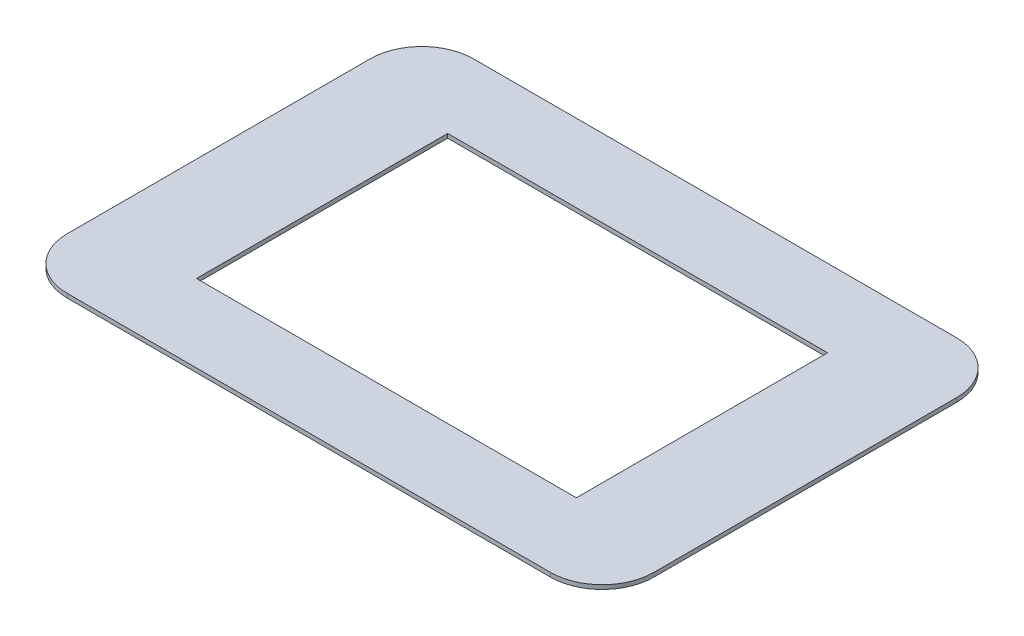
ISO-10303-21;
HEADER;
FILE_DESCRIPTION(('STEP AP214'),'2;1');
FILE_NAME('part.step','',(''),(''),'','','');
FILE_SCHEMA(('AUTOMOTIVE_DESIGN { 1 0 10303 214 1 1 1 1 }'));
ENDSEC;
DATA;
#1=APPLICATION_CONTEXT('core data for automotive mechanical design processes');
#2=APPLICATION_PROTOCOL_DEFINITION('international standard','automotive_design',2000,#1);
#3=PRODUCT_CONTEXT('',#1,'mechanical');
#4=PRODUCT('Part','Part','',(#3));
#5=PRODUCT_RELATED_PRODUCT_CATEGORY('part','',(#4));
#6=PRODUCT_DEFINITION_FORMATION('','',#4);
#7=PRODUCT_DEFINITION_CONTEXT('part definition',#1,'design');
#8=PRODUCT_DEFINITION('design','',#6,#7);
#9=PRODUCT_DEFINITION_SHAPE('','',#8);
#10=(LENGTH_UNIT() NAMED_UNIT(*) SI_UNIT(.MILLI.,.METRE.));
#11=(NAMED_UNIT(*) PLANE_ANGLE_UNIT() SI_UNIT($,.RADIAN.));
#12=(NAMED_UNIT(*) SI_UNIT($,.STERADIAN.) SOLID_ANGLE_UNIT());
#13=UNCERTAINTY_MEASURE_WITH_UNIT(LENGTH_MEASURE(1.E-05),#10,'distance_accuracy_value','');
#14=(GEOMETRIC_REPRESENTATION_CONTEXT(3) GLOBAL_UNCERTAINTY_ASSIGNED_CONTEXT((#13)) GLOBAL_UNIT_ASSIGNED_CONTEXT((#10,
#11,#12)) REPRESENTATION_CONTEXT('',''));
#15=CARTESIAN_POINT('',(0.,0.,0.));
#16=DIRECTION('',(0.,0.,1.));
#17=DIRECTION('',(1.,0.,0.));
#18=AXIS2_PLACEMENT_3D('',#15,#16,#17);
#19=CARTESIAN_POINT('',(103.5,0.8,-68.6));
#20=DIRECTION('',(0.,-1.,0.));
#21=DIRECTION('',(0.,0.,-1.));
#22=AXIS2_PLACEMENT_3D('',#19,#20,#21);
#23=PLANE('',#22);
#24=CARTESIAN_POINT('',(103.5,0.8,-68.6));
#25=DIRECTION('',(0.,1.,0.));
#26=DIRECTION('',(0.,0.,-1.));
#27=AXIS2_PLACEMENT_3D('',#24,#25,#26);
#28=CIRCLE('',#27,9.99999999999999);
#29=CARTESIAN_POINT('',(113.5,0.8,-68.6));
#30=VERTEX_POINT('',#29);
#31=CARTESIAN_POINT('',(103.5,0.8,-78.6));
#32=VERTEX_POINT('',#31);
#33=EDGE_CURVE('E158',#30,#32,#28,.T.);
#34=ORIENTED_EDGE('',*,*,#33,.T.);
#35=DIRECTION('',(-1.,0.,0.));
#36=VECTOR('',#35,1.);
#37=CARTESIAN_POINT('',(10.,0.8,-78.6));
#38=LINE('',#37,#36);
#39=CARTESIAN_POINT('',(10.,0.8,-78.6));
#40=VERTEX_POINT('',#39);
#41=EDGE_CURVE('E161',#32,#40,#38,.T.);
#42=ORIENTED_EDGE('',*,*,#41,.T.);
#43=CARTESIAN_POINT('',(10.,0.8,-68.6));
#44=DIRECTION('',(0.,1.,0.));
#45=DIRECTION('',(0.,0.,-1.));
#46=AXIS2_PLACEMENT_3D('',#43,#44,#45);
#47=CIRCLE('',#46,10.);
#48=CARTESIAN_POINT('',(0.,0.8,-68.6));
#49=VERTEX_POINT('',#48);
#50=EDGE_CURVE('E164',#40,#49,#47,.T.);
#51=ORIENTED_EDGE('',*,*,#50,.T.);
#52=DIRECTION('',(0.,0.,1.));
#53=VECTOR('',#52,1.);
#54=CARTESIAN_POINT('',(0.,0.8,-10.0000000000001));
#55=LINE('',#54,#53);
#56=CARTESIAN_POINT('',(0.,0.8,-10.0000000000001));
#57=VERTEX_POINT('',#56);
#58=EDGE_CURVE('E166',#49,#57,#55,.T.);
#59=ORIENTED_EDGE('',*,*,#58,.T.);
#60=CARTESIAN_POINT('',(10.,0.8,-10.));
#61=DIRECTION('',(0.,1.,0.));
#62=DIRECTION('',(0.,0.,-1.));
#63=AXIS2_PLACEMENT_3D('',#60,#61,#62);
#64=CIRCLE('',#63,10.);
#65=CARTESIAN_POINT('',(10.0000000000001,0.8,0.));
#66=VERTEX_POINT('',#65);
#67=EDGE_CURVE('E168',#57,#66,#64,.T.);
#68=ORIENTED_EDGE('',*,*,#67,.T.);
#69=DIRECTION('',(1.,0.,0.));
#70=VECTOR('',#69,1.);
#71=CARTESIAN_POINT('',(10.0000000000001,0.8,0.));
#72=LINE('',#71,#70);
#73=CARTESIAN_POINT('',(103.5,0.8,0.));
#74=VERTEX_POINT('',#73);
#75=EDGE_CURVE('E170',#66,#74,#72,.T.);
#76=ORIENTED_EDGE('',*,*,#75,.T.);
#77=CARTESIAN_POINT('',(103.5,0.8,-10.));
#78=DIRECTION('',(0.,1.,0.));
#79=DIRECTION('',(0.,0.,1.));
#80=AXIS2_PLACEMENT_3D('',#77,#78,#79);
#81=CIRCLE('',#80,10.);
#82=CARTESIAN_POINT('',(113.5,0.8,-10.));
#83=VERTEX_POINT('',#82);
#84=EDGE_CURVE('E172',#74,#83,#81,.T.);
#85=ORIENTED_EDGE('',*,*,#84,.T.);
#86=DIRECTION('',(0.,0.,-1.));
#87=VECTOR('',#86,1.);
#88=CARTESIAN_POINT('',(113.5,0.8,-10.));
#89=LINE('',#88,#87);
#90=EDGE_CURVE('E174',#83,#30,#89,.T.);
#91=ORIENTED_EDGE('',*,*,#90,.T.);
#92=EDGE_LOOP('',(#34,#42,#51,#59,#68,#76,#85,#91));
#93=FACE_BOUND('',#92,.T.);
#94=DIRECTION('',(0.,0.,1.));
#95=VECTOR('',#94,1.);
#96=CARTESIAN_POINT('',(20.,0.8,-15.));
#97=LINE('',#96,#95);
#98=CARTESIAN_POINT('',(20.,0.8,-63.6));
#99=VERTEX_POINT('',#98);
#100=CARTESIAN_POINT('',(20.,0.8,-15.));
#101=VERTEX_POINT('',#100);
#102=EDGE_CURVE('E122',#99,#101,#97,.T.);
#103=ORIENTED_EDGE('',*,*,#102,.F.);
#104=DIRECTION('',(-1.,0.,0.));
#105=VECTOR('',#104,1.);
#106=CARTESIAN_POINT('',(20.,0.8,-63.6));
#107=LINE('',#106,#105);
#108=CARTESIAN_POINT('',(93.5,0.8,-63.6));
#109=VERTEX_POINT('',#108);
#110=EDGE_CURVE('E144',#109,#99,#107,.T.);
#111=ORIENTED_EDGE('',*,*,#110,.F.);
#112=DIRECTION('',(0.,0.,-1.));
#113=VECTOR('',#112,1.);
#114=CARTESIAN_POINT('',(93.5,0.8,-15.));
#115=LINE('',#114,#113);
#116=CARTESIAN_POINT('',(93.5,0.8,-15.));
#117=VERTEX_POINT('',#116);
#118=EDGE_CURVE('E142',#117,#109,#115,.T.);
#119=ORIENTED_EDGE('',*,*,#118,.F.);
#120=DIRECTION('',(1.,0.,0.));
#121=VECTOR('',#120,1.);
#122=CARTESIAN_POINT('',(20.,0.8,-15.));
#123=LINE('',#122,#121);
#124=EDGE_CURVE('E130',#101,#117,#123,.T.);
#125=ORIENTED_EDGE('',*,*,#124,.F.);
#126=EDGE_LOOP('',(#103,#111,#119,#125));
#127=FACE_BOUND('',#126,.T.);
#128=ADVANCED_FACE('F33',(#93,#127),#23,.F.);
#129=CARTESIAN_POINT('',(103.5,0.,-68.6));
#130=DIRECTION('',(0.,-1.,0.));
#131=DIRECTION('',(0.,0.,-1.));
#132=AXIS2_PLACEMENT_3D('',#129,#130,#131);
#133=PLANE('',#132);
#134=CARTESIAN_POINT('',(103.5,0.,-68.6));
#135=DIRECTION('',(0.,1.,0.));
#136=DIRECTION('',(0.,0.,-1.));
#137=AXIS2_PLACEMENT_3D('',#134,#135,#136);
#138=CIRCLE('',#137,9.99999999999999);
#139=CARTESIAN_POINT('',(113.5,0.,-68.6));
#140=VERTEX_POINT('',#139);
#141=CARTESIAN_POINT('',(103.5,0.,-78.6));
#142=VERTEX_POINT('',#141);
#143=EDGE_CURVE('E138',#140,#142,#138,.T.);
#144=ORIENTED_EDGE('',*,*,#143,.F.);
#145=DIRECTION('',(0.,0.,-1.));
#146=VECTOR('',#145,1.);
#147=CARTESIAN_POINT('',(113.5,0.,-10.));
#148=LINE('',#147,#146);
#149=CARTESIAN_POINT('',(113.5,0.,-10.));
#150=VERTEX_POINT('',#149);
#151=EDGE_CURVE('E162',#150,#140,#148,.T.);
#152=ORIENTED_EDGE('',*,*,#151,.F.);
#153=CARTESIAN_POINT('',(103.5,0.,-10.));
#154=DIRECTION('',(0.,1.,0.));
#155=DIRECTION('',(0.,0.,1.));
#156=AXIS2_PLACEMENT_3D('',#153,#154,#155);
#157=CIRCLE('',#156,10.);
#158=CARTESIAN_POINT('',(103.5,0.,0.));
#159=VERTEX_POINT('',#158);
#160=EDGE_CURVE('E189',#159,#150,#157,.T.);
#161=ORIENTED_EDGE('',*,*,#160,.F.);
#162=DIRECTION('',(1.,0.,0.));
#163=VECTOR('',#162,1.);
#164=CARTESIAN_POINT('',(10.0000000000001,0.,0.));
#165=LINE('',#164,#163);
#166=CARTESIAN_POINT('',(10.0000000000001,0.,0.));
#167=VERTEX_POINT('',#166);
#168=EDGE_CURVE('E187',#167,#159,#165,.T.);
#169=ORIENTED_EDGE('',*,*,#168,.F.);
#170=CARTESIAN_POINT('',(10.,0.,-10.));
#171=DIRECTION('',(0.,1.,0.));
#172=DIRECTION('',(0.,0.,-1.));
#173=AXIS2_PLACEMENT_3D('',#170,#171,#172);
#174=CIRCLE('',#173,10.);
#175=CARTESIAN_POINT('',(0.,0.,-10.0000000000001));
#176=VERTEX_POINT('',#175);
#177=EDGE_CURVE('E185',#176,#167,#174,.T.);
#178=ORIENTED_EDGE('',*,*,#177,.F.);
#179=DIRECTION('',(0.,0.,1.));
#180=VECTOR('',#179,1.);
#181=CARTESIAN_POINT('',(0.,0.,-10.0000000000001));
#182=LINE('',#181,#180);
#183=CARTESIAN_POINT('',(0.,0.,-68.6));
#184=VERTEX_POINT('',#183);
#185=EDGE_CURVE('E183',#184,#176,#182,.T.);
#186=ORIENTED_EDGE('',*,*,#185,.F.);
#187=CARTESIAN_POINT('',(10.,0.,-68.6));
#188=DIRECTION('',(0.,1.,0.));
#189=DIRECTION('',(0.,0.,-1.));
#190=AXIS2_PLACEMENT_3D('',#187,#188,#189);
#191=CIRCLE('',#190,10.);
#192=CARTESIAN_POINT('',(10.,0.,-78.6));
#193=VERTEX_POINT('',#192);
#194=EDGE_CURVE('E181',#193,#184,#191,.T.);
#195=ORIENTED_EDGE('',*,*,#194,.F.);
#196=DIRECTION('',(-1.,0.,0.));
#197=VECTOR('',#196,1.);
#198=CARTESIAN_POINT('',(10.,0.,-78.6));
#199=LINE('',#198,#197);
#200=EDGE_CURVE('E179',#142,#193,#199,.T.);
#201=ORIENTED_EDGE('',*,*,#200,.F.);
#202=EDGE_LOOP('',(#144,#152,#161,#169,#178,#186,#195,#201));
#203=FACE_BOUND('',#202,.T.);
#204=DIRECTION('',(-1.,0.,0.));
#205=VECTOR('',#204,1.);
#206=CARTESIAN_POINT('',(20.,0.,-63.6));
#207=LINE('',#206,#205);
#208=CARTESIAN_POINT('',(93.5,0.,-63.6));
#209=VERTEX_POINT('',#208);
#210=CARTESIAN_POINT('',(20.,0.,-63.6));
#211=VERTEX_POINT('',#210);
#212=EDGE_CURVE('E131',#209,#211,#207,.T.);
#213=ORIENTED_EDGE('',*,*,#212,.T.);
#214=DIRECTION('',(0.,0.,1.));
#215=VECTOR('',#214,1.);
#216=CARTESIAN_POINT('',(20.,0.,-15.));
#217=LINE('',#216,#215);
#218=CARTESIAN_POINT('',(20.,0.,-15.));
#219=VERTEX_POINT('',#218);
#220=EDGE_CURVE('E56',#211,#219,#217,.T.);
#221=ORIENTED_EDGE('',*,*,#220,.T.);
#222=DIRECTION('',(1.,0.,0.));
#223=VECTOR('',#222,1.);
#224=CARTESIAN_POINT('',(20.,0.,-15.));
#225=LINE('',#224,#223);
#226=CARTESIAN_POINT('',(93.5,0.,-15.));
#227=VERTEX_POINT('',#226);
#228=EDGE_CURVE('E137',#219,#227,#225,.T.);
#229=ORIENTED_EDGE('',*,*,#228,.T.);
#230=DIRECTION('',(0.,0.,-1.));
#231=VECTOR('',#230,1.);
#232=CARTESIAN_POINT('',(93.5,0.,-15.));
#233=LINE('',#232,#231);
#234=EDGE_CURVE('E150',#227,#209,#233,.T.);
#235=ORIENTED_EDGE('',*,*,#234,.T.);
#236=EDGE_LOOP('',(#213,#221,#229,#235));
#237=FACE_BOUND('',#236,.T.);
#238=ADVANCED_FACE('F219',(#203,#237),#133,.T.);
#239=CARTESIAN_POINT('',(103.5,0.8,-68.6));
#240=DIRECTION('',(0.,-1.,0.));
#241=DIRECTION('',(0.,0.,-1.));
#242=AXIS2_PLACEMENT_3D('',#239,#240,#241);
#243=CYLINDRICAL_SURFACE('',#242,9.99999999999999);
#244=ORIENTED_EDGE('',*,*,#143,.T.);
#245=DIRECTION('',(0.,-1.,0.));
#246=VECTOR('',#245,1.);
#247=CARTESIAN_POINT('',(103.5,0.8,-78.6));
#248=LINE('',#247,#246);
#249=EDGE_CURVE('E11',#32,#142,#248,.T.);
#250=ORIENTED_EDGE('',*,*,#249,.F.);
#251=ORIENTED_EDGE('',*,*,#33,.F.);
#252=DIRECTION('',(0.,-1.,0.));
#253=VECTOR('',#252,1.);
#254=CARTESIAN_POINT('',(113.5,0.8,-68.6));
#255=LINE('',#254,#253);
#256=EDGE_CURVE('E176',#30,#140,#255,.T.);
#257=ORIENTED_EDGE('',*,*,#256,.T.);
#258=EDGE_LOOP('',(#244,#250,#251,#257));
#259=FACE_BOUND('',#258,.T.);
#260=ADVANCED_FACE('F35',(#259),#243,.T.);
#261=CARTESIAN_POINT('',(10.,0.8,-78.6));
#262=DIRECTION('',(0.,0.,1.));
#263=DIRECTION('',(1.,0.,0.));
#264=AXIS2_PLACEMENT_3D('',#261,#262,#263);
#265=PLANE('',#264);
#266=ORIENTED_EDGE('',*,*,#200,.T.);
#267=DIRECTION('',(0.,-1.,0.));
#268=VECTOR('',#267,1.);
#269=CARTESIAN_POINT('',(10.,0.8,-78.6));
#270=LINE('',#269,#268);
#271=EDGE_CURVE('E41',#40,#193,#270,.T.);
#272=ORIENTED_EDGE('',*,*,#271,.F.);
#273=ORIENTED_EDGE('',*,*,#41,.F.);
#274=ORIENTED_EDGE('',*,*,#249,.T.);
#275=EDGE_LOOP('',(#266,#272,#273,#274));
#276=FACE_BOUND('',#275,.T.);
#277=ADVANCED_FACE('F236',(#276),#265,.F.);
#278=CARTESIAN_POINT('',(10.,0.8,-68.6));
#279=DIRECTION('',(0.,-1.,0.));
#280=DIRECTION('',(0.,0.,-1.));
#281=AXIS2_PLACEMENT_3D('',#278,#279,#280);
#282=CYLINDRICAL_SURFACE('',#281,10.);
#283=ORIENTED_EDGE('',*,*,#194,.T.);
#284=DIRECTION('',(0.,-1.,0.));
#285=VECTOR('',#284,1.);
#286=CARTESIAN_POINT('',(0.,0.8,-68.6));
#287=LINE('',#286,#285);
#288=EDGE_CURVE('E206',#49,#184,#287,.T.);
#289=ORIENTED_EDGE('',*,*,#288,.F.);
#290=ORIENTED_EDGE('',*,*,#50,.F.);
#291=ORIENTED_EDGE('',*,*,#271,.T.);
#292=EDGE_LOOP('',(#283,#289,#290,#291));
#293=FACE_BOUND('',#292,.T.);
#294=ADVANCED_FACE('F213',(#293),#282,.T.);
#295=CARTESIAN_POINT('',(0.,0.8,-10.0000000000001));
#296=DIRECTION('',(1.,0.,0.));
#297=DIRECTION('',(0.,0.,-1.));
#298=AXIS2_PLACEMENT_3D('',#295,#296,#297);
#299=PLANE('',#298);
#300=ORIENTED_EDGE('',*,*,#185,.T.);
#301=DIRECTION('',(0.,-1.,0.));
#302=VECTOR('',#301,1.);
#303=CARTESIAN_POINT('',(0.,0.8,-10.0000000000001));
#304=LINE('',#303,#302);
#305=EDGE_CURVE('E203',#57,#176,#304,.T.);
#306=ORIENTED_EDGE('',*,*,#305,.F.);
#307=ORIENTED_EDGE('',*,*,#58,.F.);
#308=ORIENTED_EDGE('',*,*,#288,.T.);
#309=EDGE_LOOP('',(#300,#306,#307,#308));
#310=FACE_BOUND('',#309,.T.);
#311=ADVANCED_FACE('F225',(#310),#299,.F.);
#312=CARTESIAN_POINT('',(10.,0.8,-10.));
#313=DIRECTION('',(0.,-1.,0.));
#314=DIRECTION('',(0.,0.,-1.));
#315=AXIS2_PLACEMENT_3D('',#312,#313,#314);
#316=CYLINDRICAL_SURFACE('',#315,10.);
#317=ORIENTED_EDGE('',*,*,#177,.T.);
#318=DIRECTION('',(0.,-1.,0.));
#319=VECTOR('',#318,1.);
#320=CARTESIAN_POINT('',(10.0000000000001,0.8,0.));
#321=LINE('',#320,#319);
#322=EDGE_CURVE('E200',#66,#167,#321,.T.);
#323=ORIENTED_EDGE('',*,*,#322,.F.);
#324=ORIENTED_EDGE('',*,*,#67,.F.);
#325=ORIENTED_EDGE('',*,*,#305,.T.);
#326=EDGE_LOOP('',(#317,#323,#324,#325));
#327=FACE_BOUND('',#326,.T.);
#328=ADVANCED_FACE('F229',(#327),#316,.T.);
#329=CARTESIAN_POINT('',(10.0000000000001,0.8,0.));
#330=DIRECTION('',(0.,0.,-1.));
#331=DIRECTION('',(-1.,0.,0.));
#332=AXIS2_PLACEMENT_3D('',#329,#330,#331);
#333=PLANE('',#332);
#334=ORIENTED_EDGE('',*,*,#168,.T.);
#335=DIRECTION('',(0.,-1.,0.));
#336=VECTOR('',#335,1.);
#337=CARTESIAN_POINT('',(103.5,0.8,0.));
#338=LINE('',#337,#336);
#339=EDGE_CURVE('E197',#74,#159,#338,.T.);
#340=ORIENTED_EDGE('',*,*,#339,.F.);
#341=ORIENTED_EDGE('',*,*,#75,.F.);
#342=ORIENTED_EDGE('',*,*,#322,.T.);
#343=EDGE_LOOP('',(#334,#340,#341,#342));
#344=FACE_BOUND('',#343,.T.);
#345=ADVANCED_FACE('F249',(#344),#333,.F.);
#346=CARTESIAN_POINT('',(103.5,0.8,-10.));
#347=DIRECTION('',(0.,-1.,0.));
#348=DIRECTION('',(0.,0.,-1.));
#349=AXIS2_PLACEMENT_3D('',#346,#347,#348);
#350=CYLINDRICAL_SURFACE('',#349,10.);
#351=ORIENTED_EDGE('',*,*,#160,.T.);
#352=DIRECTION('',(0.,-1.,0.));
#353=VECTOR('',#352,1.);
#354=CARTESIAN_POINT('',(113.5,0.8,-10.));
#355=LINE('',#354,#353);
#356=EDGE_CURVE('E194',#83,#150,#355,.T.);
#357=ORIENTED_EDGE('',*,*,#356,.F.);
#358=ORIENTED_EDGE('',*,*,#84,.F.);
#359=ORIENTED_EDGE('',*,*,#339,.T.);
#360=EDGE_LOOP('',(#351,#357,#358,#359));
#361=FACE_BOUND('',#360,.T.);
#362=ADVANCED_FACE('F247',(#361),#350,.T.);
#363=CARTESIAN_POINT('',(113.5,0.8,-10.));
#364=DIRECTION('',(-1.,0.,0.));
#365=DIRECTION('',(0.,0.,1.));
#366=AXIS2_PLACEMENT_3D('',#363,#364,#365);
#367=PLANE('',#366);
#368=ORIENTED_EDGE('',*,*,#151,.T.);
#369=ORIENTED_EDGE('',*,*,#256,.F.);
#370=ORIENTED_EDGE('',*,*,#90,.F.);
#371=ORIENTED_EDGE('',*,*,#356,.T.);
#372=EDGE_LOOP('',(#368,#369,#370,#371));
#373=FACE_BOUND('',#372,.T.);
#374=ADVANCED_FACE('F242',(#373),#367,.F.);
#375=CARTESIAN_POINT('',(20.,0.8,-15.));
#376=DIRECTION('',(1.,0.,0.));
#377=DIRECTION('',(0.,0.,-1.));
#378=AXIS2_PLACEMENT_3D('',#375,#376,#377);
#379=PLANE('',#378);
#380=ORIENTED_EDGE('',*,*,#220,.F.);
#381=DIRECTION('',(0.,-1.,0.));
#382=VECTOR('',#381,1.);
#383=CARTESIAN_POINT('',(20.,0.8,-63.6));
#384=LINE('',#383,#382);
#385=EDGE_CURVE('E126',#99,#211,#384,.T.);
#386=ORIENTED_EDGE('',*,*,#385,.F.);
#387=ORIENTED_EDGE('',*,*,#102,.T.);
#388=DIRECTION('',(0.,-1.,0.));
#389=VECTOR('',#388,1.);
#390=CARTESIAN_POINT('',(20.,0.8,-15.));
#391=LINE('',#390,#389);
#392=EDGE_CURVE('E125',#101,#219,#391,.T.);
#393=ORIENTED_EDGE('',*,*,#392,.T.);
#394=EDGE_LOOP('',(#380,#386,#387,#393));
#395=FACE_BOUND('',#394,.T.);
#396=ADVANCED_FACE('F124',(#395),#379,.T.);
#397=CARTESIAN_POINT('',(20.,0.8,-15.));
#398=DIRECTION('',(0.,0.,-1.));
#399=DIRECTION('',(-1.,0.,0.));
#400=AXIS2_PLACEMENT_3D('',#397,#398,#399);
#401=PLANE('',#400);
#402=ORIENTED_EDGE('',*,*,#228,.F.);
#403=ORIENTED_EDGE('',*,*,#392,.F.);
#404=ORIENTED_EDGE('',*,*,#124,.T.);
#405=DIRECTION('',(0.,-1.,0.));
#406=VECTOR('',#405,1.);
#407=CARTESIAN_POINT('',(93.5,0.8,-15.));
#408=LINE('',#407,#406);
#409=EDGE_CURVE('E139',#117,#227,#408,.T.);
#410=ORIENTED_EDGE('',*,*,#409,.T.);
#411=EDGE_LOOP('',(#402,#403,#404,#410));
#412=FACE_BOUND('',#411,.T.);
#413=ADVANCED_FACE('F134',(#412),#401,.T.);
#414=CARTESIAN_POINT('',(93.5,0.8,-15.));
#415=DIRECTION('',(-1.,0.,0.));
#416=DIRECTION('',(0.,0.,1.));
#417=AXIS2_PLACEMENT_3D('',#414,#415,#416);
#418=PLANE('',#417);
#419=ORIENTED_EDGE('',*,*,#234,.F.);
#420=ORIENTED_EDGE('',*,*,#409,.F.);
#421=ORIENTED_EDGE('',*,*,#118,.T.);
#422=DIRECTION('',(0.,-1.,0.));
#423=VECTOR('',#422,1.);
#424=CARTESIAN_POINT('',(93.5,0.8,-63.6));
#425=LINE('',#424,#423);
#426=EDGE_CURVE('E48',#109,#209,#425,.T.);
#427=ORIENTED_EDGE('',*,*,#426,.T.);
#428=EDGE_LOOP('',(#419,#420,#421,#427));
#429=FACE_BOUND('',#428,.T.);
#430=ADVANCED_FACE('F274',(#429),#418,.T.);
#431=CARTESIAN_POINT('',(20.,0.8,-63.6));
#432=DIRECTION('',(0.,0.,1.));
#433=DIRECTION('',(1.,0.,0.));
#434=AXIS2_PLACEMENT_3D('',#431,#432,#433);
#435=PLANE('',#434);
#436=ORIENTED_EDGE('',*,*,#212,.F.);
#437=ORIENTED_EDGE('',*,*,#426,.F.);
#438=ORIENTED_EDGE('',*,*,#110,.T.);
#439=ORIENTED_EDGE('',*,*,#385,.T.);
#440=EDGE_LOOP('',(#436,#437,#438,#439));
#441=FACE_BOUND('',#440,.T.);
#442=ADVANCED_FACE('F278',(#441),#435,.T.);
#443=CLOSED_SHELL('',(#128,#238,#260,#277,#294,#311,#328,#345,#362,#374,#396,#413,#430,#442));
#444=MANIFOLD_SOLID_BREP('B2',#443);
#445=ADVANCED_BREP_SHAPE_REPRESENTATION('',(#18,#444),#14);
#446=SHAPE_DEFINITION_REPRESENTATION(#9,#445);
ENDSEC;
END-ISO-10303-21;
